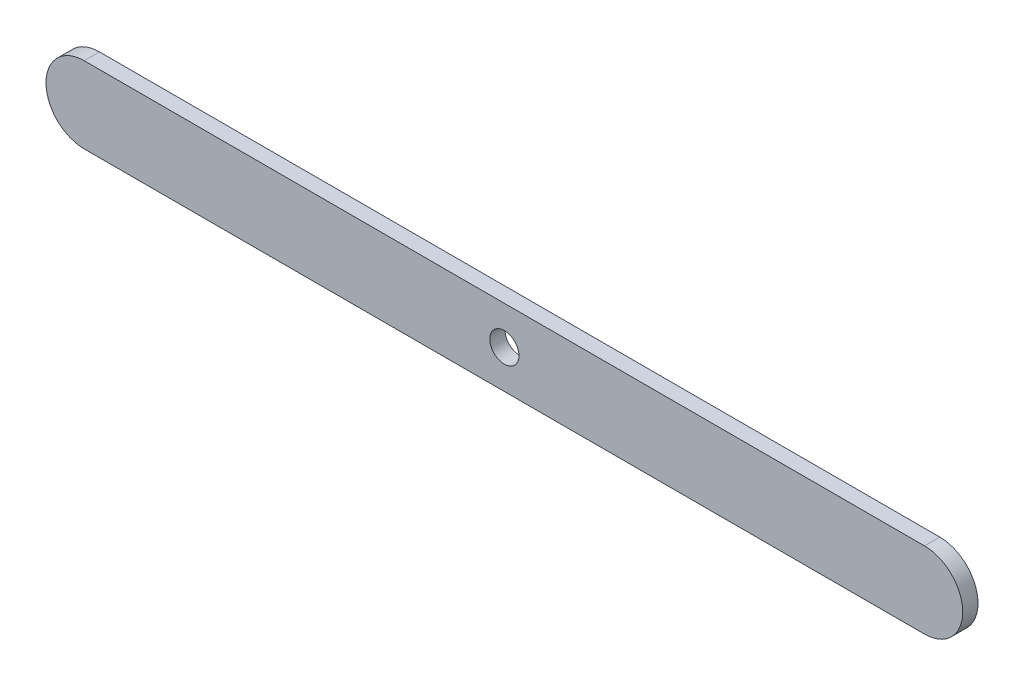
ISO-10303-21;
HEADER;
FILE_DESCRIPTION(('STEP AP214'),'2;1');
FILE_NAME('part.step','',(''),(''),'','','');
FILE_SCHEMA(('AUTOMOTIVE_DESIGN { 1 0 10303 214 1 1 1 1 }'));
ENDSEC;
DATA;
#1=APPLICATION_CONTEXT('core data for automotive mechanical design processes');
#2=APPLICATION_PROTOCOL_DEFINITION('international standard','automotive_design',2000,#1);
#3=PRODUCT_CONTEXT('',#1,'mechanical');
#4=PRODUCT('Part','Part','',(#3));
#5=PRODUCT_RELATED_PRODUCT_CATEGORY('part','',(#4));
#6=PRODUCT_DEFINITION_FORMATION('','',#4);
#7=PRODUCT_DEFINITION_CONTEXT('part definition',#1,'design');
#8=PRODUCT_DEFINITION('design','',#6,#7);
#9=PRODUCT_DEFINITION_SHAPE('','',#8);
#10=(LENGTH_UNIT() NAMED_UNIT(*) SI_UNIT(.MILLI.,.METRE.));
#11=(NAMED_UNIT(*) PLANE_ANGLE_UNIT() SI_UNIT($,.RADIAN.));
#12=(NAMED_UNIT(*) SI_UNIT($,.STERADIAN.) SOLID_ANGLE_UNIT());
#13=UNCERTAINTY_MEASURE_WITH_UNIT(LENGTH_MEASURE(1.E-05),#10,'distance_accuracy_value','');
#14=(GEOMETRIC_REPRESENTATION_CONTEXT(3) GLOBAL_UNCERTAINTY_ASSIGNED_CONTEXT((#13)) GLOBAL_UNIT_ASSIGNED_CONTEXT((#10,
#11,#12)) REPRESENTATION_CONTEXT('',''));
#15=CARTESIAN_POINT('',(0.,0.,0.));
#16=DIRECTION('',(0.,0.,1.));
#17=DIRECTION('',(1.,0.,0.));
#18=AXIS2_PLACEMENT_3D('',#15,#16,#17);
#19=CARTESIAN_POINT('',(0.,0.,2.54));
#20=DIRECTION('',(0.,0.,1.));
#21=DIRECTION('',(1.,0.,0.));
#22=AXIS2_PLACEMENT_3D('',#19,#20,#21);
#23=PLANE('',#22);
#24=CARTESIAN_POINT('',(0.,0.,2.54));
#25=DIRECTION('',(0.,0.,1.));
#26=DIRECTION('',(1.,0.,0.));
#27=AXIS2_PLACEMENT_3D('',#24,#25,#26);
#28=CIRCLE('',#27,6.35);
#29=CARTESIAN_POINT('',(0.,6.35,2.54));
#30=VERTEX_POINT('',#29);
#31=CARTESIAN_POINT('',(0.,-6.35,2.54));
#32=VERTEX_POINT('',#31);
#33=EDGE_CURVE('E85',#30,#32,#28,.T.);
#34=ORIENTED_EDGE('',*,*,#33,.T.);
#35=DIRECTION('',(1.,0.,0.));
#36=VECTOR('',#35,1.);
#37=CARTESIAN_POINT('',(0.,-6.35,2.54));
#38=LINE('',#37,#36);
#39=CARTESIAN_POINT('',(139.7,-6.35,2.54));
#40=VERTEX_POINT('',#39);
#41=EDGE_CURVE('E80',#32,#40,#38,.T.);
#42=ORIENTED_EDGE('',*,*,#41,.T.);
#43=CARTESIAN_POINT('',(139.7,0.,2.54));
#44=DIRECTION('',(0.,0.,1.));
#45=DIRECTION('',(1.,0.,0.));
#46=AXIS2_PLACEMENT_3D('',#43,#44,#45);
#47=CIRCLE('',#46,6.35);
#48=CARTESIAN_POINT('',(139.7,6.35,2.54));
#49=VERTEX_POINT('',#48);
#50=EDGE_CURVE('E83',#40,#49,#47,.T.);
#51=ORIENTED_EDGE('',*,*,#50,.T.);
#52=DIRECTION('',(-1.,0.,0.));
#53=VECTOR('',#52,1.);
#54=CARTESIAN_POINT('',(0.,6.35,2.54));
#55=LINE('',#54,#53);
#56=EDGE_CURVE('E50',#49,#30,#55,.T.);
#57=ORIENTED_EDGE('',*,*,#56,.T.);
#58=EDGE_LOOP('',(#34,#42,#51,#57));
#59=FACE_BOUND('',#58,.T.);
#60=CARTESIAN_POINT('',(69.85,0.,2.54));
#61=DIRECTION('',(0.,0.,1.));
#62=DIRECTION('',(1.,0.,0.));
#63=AXIS2_PLACEMENT_3D('',#60,#61,#62);
#64=CIRCLE('',#63,2.4257);
#65=CARTESIAN_POINT('',(72.2757,0.,2.54));
#66=VERTEX_POINT('',#65);
#67=EDGE_CURVE('E100',#66,#66,#64,.T.);
#68=ORIENTED_EDGE('',*,*,#67,.F.);
#69=EDGE_LOOP('',(#68));
#70=FACE_BOUND('',#69,.T.);
#71=ADVANCED_FACE('F33',(#59,#70),#23,.T.);
#72=CARTESIAN_POINT('',(0.,0.,0.));
#73=DIRECTION('',(0.,0.,1.));
#74=DIRECTION('',(1.,0.,0.));
#75=AXIS2_PLACEMENT_3D('',#72,#73,#74);
#76=PLANE('',#75);
#77=CARTESIAN_POINT('',(0.,0.,0.));
#78=DIRECTION('',(0.,0.,1.));
#79=DIRECTION('',(1.,0.,0.));
#80=AXIS2_PLACEMENT_3D('',#77,#78,#79);
#81=CIRCLE('',#80,6.35);
#82=CARTESIAN_POINT('',(0.,6.35,0.));
#83=VERTEX_POINT('',#82);
#84=CARTESIAN_POINT('',(0.,-6.35,0.));
#85=VERTEX_POINT('',#84);
#86=EDGE_CURVE('E97',#83,#85,#81,.T.);
#87=ORIENTED_EDGE('',*,*,#86,.F.);
#88=DIRECTION('',(-1.,0.,0.));
#89=VECTOR('',#88,1.);
#90=CARTESIAN_POINT('',(0.,6.35,0.));
#91=LINE('',#90,#89);
#92=CARTESIAN_POINT('',(139.7,6.35,0.));
#93=VERTEX_POINT('',#92);
#94=EDGE_CURVE('E73',#93,#83,#91,.T.);
#95=ORIENTED_EDGE('',*,*,#94,.F.);
#96=CARTESIAN_POINT('',(139.7,0.,0.));
#97=DIRECTION('',(0.,0.,1.));
#98=DIRECTION('',(1.,0.,0.));
#99=AXIS2_PLACEMENT_3D('',#96,#97,#98);
#100=CIRCLE('',#99,6.35);
#101=CARTESIAN_POINT('',(139.7,-6.35,0.));
#102=VERTEX_POINT('',#101);
#103=EDGE_CURVE('E67',#102,#93,#100,.T.);
#104=ORIENTED_EDGE('',*,*,#103,.F.);
#105=DIRECTION('',(1.,0.,0.));
#106=VECTOR('',#105,1.);
#107=CARTESIAN_POINT('',(0.,-6.35,0.));
#108=LINE('',#107,#106);
#109=EDGE_CURVE('E89',#85,#102,#108,.T.);
#110=ORIENTED_EDGE('',*,*,#109,.F.);
#111=EDGE_LOOP('',(#87,#95,#104,#110));
#112=FACE_BOUND('',#111,.T.);
#113=CARTESIAN_POINT('',(69.85,0.,0.));
#114=DIRECTION('',(0.,0.,1.));
#115=DIRECTION('',(1.,0.,0.));
#116=AXIS2_PLACEMENT_3D('',#113,#114,#115);
#117=CIRCLE('',#116,2.4257);
#118=CARTESIAN_POINT('',(72.2757,0.,0.));
#119=VERTEX_POINT('',#118);
#120=EDGE_CURVE('E112',#119,#119,#117,.T.);
#121=ORIENTED_EDGE('',*,*,#120,.T.);
#122=EDGE_LOOP('',(#121));
#123=FACE_BOUND('',#122,.T.);
#124=ADVANCED_FACE('F108',(#112,#123),#76,.F.);
#125=CARTESIAN_POINT('',(0.,0.,2.54));
#126=DIRECTION('',(0.,0.,-1.));
#127=DIRECTION('',(-1.,0.,0.));
#128=AXIS2_PLACEMENT_3D('',#125,#126,#127);
#129=CYLINDRICAL_SURFACE('',#128,6.35);
#130=ORIENTED_EDGE('',*,*,#86,.T.);
#131=DIRECTION('',(0.,0.,-1.));
#132=VECTOR('',#131,1.);
#133=CARTESIAN_POINT('',(0.,-6.35,2.54));
#134=LINE('',#133,#132);
#135=EDGE_CURVE('E11',#32,#85,#134,.T.);
#136=ORIENTED_EDGE('',*,*,#135,.F.);
#137=ORIENTED_EDGE('',*,*,#33,.F.);
#138=DIRECTION('',(0.,0.,-1.));
#139=VECTOR('',#138,1.);
#140=CARTESIAN_POINT('',(0.,6.35,2.54));
#141=LINE('',#140,#139);
#142=EDGE_CURVE('E93',#30,#83,#141,.T.);
#143=ORIENTED_EDGE('',*,*,#142,.T.);
#144=EDGE_LOOP('',(#130,#136,#137,#143));
#145=FACE_BOUND('',#144,.T.);
#146=ADVANCED_FACE('F35',(#145),#129,.T.);
#147=CARTESIAN_POINT('',(0.,-6.35,2.54));
#148=DIRECTION('',(0.,1.,0.));
#149=DIRECTION('',(0.,0.,1.));
#150=AXIS2_PLACEMENT_3D('',#147,#148,#149);
#151=PLANE('',#150);
#152=ORIENTED_EDGE('',*,*,#109,.T.);
#153=DIRECTION('',(0.,0.,-1.));
#154=VECTOR('',#153,1.);
#155=CARTESIAN_POINT('',(139.7,-6.35,2.54));
#156=LINE('',#155,#154);
#157=EDGE_CURVE('E42',#40,#102,#156,.T.);
#158=ORIENTED_EDGE('',*,*,#157,.F.);
#159=ORIENTED_EDGE('',*,*,#41,.F.);
#160=ORIENTED_EDGE('',*,*,#135,.T.);
#161=EDGE_LOOP('',(#152,#158,#159,#160));
#162=FACE_BOUND('',#161,.T.);
#163=ADVANCED_FACE('F88',(#162),#151,.F.);
#164=CARTESIAN_POINT('',(139.7,0.,2.54));
#165=DIRECTION('',(0.,0.,-1.));
#166=DIRECTION('',(-1.,0.,0.));
#167=AXIS2_PLACEMENT_3D('',#164,#165,#166);
#168=CYLINDRICAL_SURFACE('',#167,6.35);
#169=ORIENTED_EDGE('',*,*,#103,.T.);
#170=DIRECTION('',(0.,0.,-1.));
#171=VECTOR('',#170,1.);
#172=CARTESIAN_POINT('',(139.7,6.35,2.54));
#173=LINE('',#172,#171);
#174=EDGE_CURVE('E90',#49,#93,#173,.T.);
#175=ORIENTED_EDGE('',*,*,#174,.F.);
#176=ORIENTED_EDGE('',*,*,#50,.F.);
#177=ORIENTED_EDGE('',*,*,#157,.T.);
#178=EDGE_LOOP('',(#169,#175,#176,#177));
#179=FACE_BOUND('',#178,.T.);
#180=ADVANCED_FACE('F91',(#179),#168,.T.);
#181=CARTESIAN_POINT('',(0.,6.35,2.54));
#182=DIRECTION('',(0.,-1.,0.));
#183=DIRECTION('',(0.,0.,-1.));
#184=AXIS2_PLACEMENT_3D('',#181,#182,#183);
#185=PLANE('',#184);
#186=ORIENTED_EDGE('',*,*,#94,.T.);
#187=ORIENTED_EDGE('',*,*,#142,.F.);
#188=ORIENTED_EDGE('',*,*,#56,.F.);
#189=ORIENTED_EDGE('',*,*,#174,.T.);
#190=EDGE_LOOP('',(#186,#187,#188,#189));
#191=FACE_BOUND('',#190,.T.);
#192=ADVANCED_FACE('F105',(#191),#185,.F.);
#193=CARTESIAN_POINT('',(69.85,0.,2.54));
#194=DIRECTION('',(0.,0.,-1.));
#195=DIRECTION('',(-1.,0.,0.));
#196=AXIS2_PLACEMENT_3D('',#193,#194,#195);
#197=CYLINDRICAL_SURFACE('',#196,2.4257);
#198=ORIENTED_EDGE('',*,*,#67,.T.);
#199=EDGE_LOOP('',(#198));
#200=FACE_BOUND('',#199,.T.);
#201=ORIENTED_EDGE('',*,*,#120,.F.);
#202=EDGE_LOOP('',(#201));
#203=FACE_BOUND('',#202,.T.);
#204=ADVANCED_FACE('F118',(#200,#203),#197,.F.);
#205=CLOSED_SHELL('',(#71,#124,#146,#163,#180,#192,#204));
#206=MANIFOLD_SOLID_BREP('B2',#205);
#207=ADVANCED_BREP_SHAPE_REPRESENTATION('',(#18,#206),#14);
#208=SHAPE_DEFINITION_REPRESENTATION(#9,#207);
ENDSEC;
END-ISO-10303-21;
